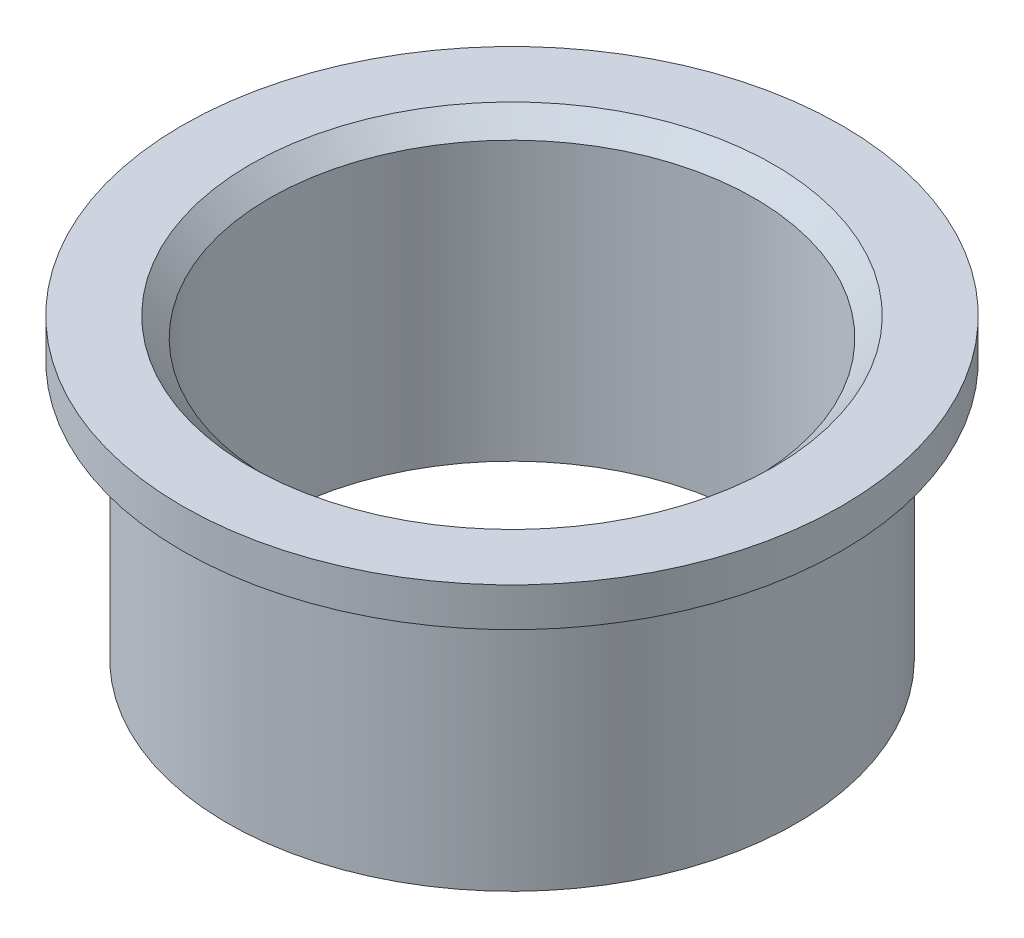
ISO-10303-21;
HEADER;
FILE_DESCRIPTION(('STEP AP214'),'2;1');
FILE_NAME('part.step','',(''),(''),'','','');
FILE_SCHEMA(('AUTOMOTIVE_DESIGN { 1 0 10303 214 1 1 1 1 }'));
ENDSEC;
DATA;
#1=APPLICATION_CONTEXT('core data for automotive mechanical design processes');
#2=APPLICATION_PROTOCOL_DEFINITION('international standard','automotive_design',2000,#1);
#3=PRODUCT_CONTEXT('',#1,'mechanical');
#4=PRODUCT('Part','Part','',(#3));
#5=PRODUCT_RELATED_PRODUCT_CATEGORY('part','',(#4));
#6=PRODUCT_DEFINITION_FORMATION('','',#4);
#7=PRODUCT_DEFINITION_CONTEXT('part definition',#1,'design');
#8=PRODUCT_DEFINITION('design','',#6,#7);
#9=PRODUCT_DEFINITION_SHAPE('','',#8);
#10=(LENGTH_UNIT() NAMED_UNIT(*) SI_UNIT(.MILLI.,.METRE.));
#11=(NAMED_UNIT(*) PLANE_ANGLE_UNIT() SI_UNIT($,.RADIAN.));
#12=(NAMED_UNIT(*) SI_UNIT($,.STERADIAN.) SOLID_ANGLE_UNIT());
#13=UNCERTAINTY_MEASURE_WITH_UNIT(LENGTH_MEASURE(1.E-05),#10,'distance_accuracy_value','');
#14=(GEOMETRIC_REPRESENTATION_CONTEXT(3) GLOBAL_UNCERTAINTY_ASSIGNED_CONTEXT((#13)) GLOBAL_UNIT_ASSIGNED_CONTEXT((#10,
#11,#12)) REPRESENTATION_CONTEXT('',''));
#15=CARTESIAN_POINT('',(0.,0.,0.));
#16=DIRECTION('',(0.,0.,1.));
#17=DIRECTION('',(1.,0.,0.));
#18=AXIS2_PLACEMENT_3D('',#15,#16,#17);
#19=CARTESIAN_POINT('',(0.,0.,0.));
#20=DIRECTION('',(0.,1.,0.));
#21=DIRECTION('',(-1.,0.,0.));
#22=AXIS2_PLACEMENT_3D('',#19,#20,#21);
#23=CYLINDRICAL_SURFACE('',#22,51.);
#24=CARTESIAN_POINT('',(0.,-5.99999999999999,0.));
#25=DIRECTION('',(0.,1.,0.));
#26=DIRECTION('',(-1.,0.,0.));
#27=AXIS2_PLACEMENT_3D('',#24,#25,#26);
#28=CIRCLE('',#27,51.);
#29=CARTESIAN_POINT('',(-51.,-6.,0.));
#30=VERTEX_POINT('',#29);
#31=EDGE_CURVE('E56',#30,#30,#28,.T.);
#32=ORIENTED_EDGE('',*,*,#31,.T.);
#33=EDGE_LOOP('',(#32));
#34=FACE_BOUND('',#33,.T.);
#35=CARTESIAN_POINT('',(0.,0.,0.));
#36=DIRECTION('',(0.,1.,0.));
#37=DIRECTION('',(-1.,0.,0.));
#38=AXIS2_PLACEMENT_3D('',#35,#36,#37);
#39=CIRCLE('',#38,51.);
#40=CARTESIAN_POINT('',(-51.,0.,0.));
#41=VERTEX_POINT('',#40);
#42=EDGE_CURVE('E10',#41,#41,#39,.T.);
#43=ORIENTED_EDGE('',*,*,#42,.F.);
#44=EDGE_LOOP('',(#43));
#45=FACE_BOUND('',#44,.T.);
#46=ADVANCED_FACE('F31',(#34,#45),#23,.T.);
#47=CARTESIAN_POINT('',(-51.,0.,0.));
#48=DIRECTION('',(0.,1.,0.));
#49=DIRECTION('',(-1.,0.,0.));
#50=AXIS2_PLACEMENT_3D('',#47,#48,#49);
#51=PLANE('',#50);
#52=ORIENTED_EDGE('',*,*,#42,.T.);
#53=EDGE_LOOP('',(#52));
#54=FACE_BOUND('',#53,.T.);
#55=CARTESIAN_POINT('',(0.,0.,0.));
#56=DIRECTION('',(0.,1.,0.));
#57=DIRECTION('',(-1.,0.,0.));
#58=AXIS2_PLACEMENT_3D('',#55,#56,#57);
#59=CIRCLE('',#58,40.5);
#60=CARTESIAN_POINT('',(-40.5,0.,0.));
#61=VERTEX_POINT('',#60);
#62=EDGE_CURVE('E37',#61,#61,#59,.T.);
#63=ORIENTED_EDGE('',*,*,#62,.F.);
#64=EDGE_LOOP('',(#63));
#65=FACE_BOUND('',#64,.T.);
#66=ADVANCED_FACE('F74',(#54,#65),#51,.T.);
#67=CARTESIAN_POINT('',(0.,-3.,0.));
#68=DIRECTION('',(0.,1.,0.));
#69=DIRECTION('',(-1.,0.,0.));
#70=AXIS2_PLACEMENT_3D('',#67,#68,#69);
#71=CONICAL_SURFACE('',#70,37.5,0.785398163397446);
#72=ORIENTED_EDGE('',*,*,#62,.T.);
#73=EDGE_LOOP('',(#72));
#74=FACE_BOUND('',#73,.T.);
#75=CARTESIAN_POINT('',(0.,-3.,0.));
#76=DIRECTION('',(0.,1.,0.));
#77=DIRECTION('',(-1.,0.,0.));
#78=AXIS2_PLACEMENT_3D('',#75,#76,#77);
#79=CIRCLE('',#78,37.5);
#80=CARTESIAN_POINT('',(-37.5,-3.,0.));
#81=VERTEX_POINT('',#80);
#82=EDGE_CURVE('E41',#81,#81,#79,.T.);
#83=ORIENTED_EDGE('',*,*,#82,.F.);
#84=EDGE_LOOP('',(#83));
#85=FACE_BOUND('',#84,.T.);
#86=ADVANCED_FACE('F78',(#74,#85),#71,.F.);
#87=CARTESIAN_POINT('',(0.,0.,0.));
#88=DIRECTION('',(0.,1.,0.));
#89=DIRECTION('',(-1.,0.,0.));
#90=AXIS2_PLACEMENT_3D('',#87,#88,#89);
#91=CYLINDRICAL_SURFACE('',#90,37.5);
#92=ORIENTED_EDGE('',*,*,#82,.T.);
#93=EDGE_LOOP('',(#92));
#94=FACE_BOUND('',#93,.T.);
#95=CARTESIAN_POINT('',(0.,-46.,0.));
#96=DIRECTION('',(0.,1.,0.));
#97=DIRECTION('',(-1.,0.,0.));
#98=AXIS2_PLACEMENT_3D('',#95,#96,#97);
#99=CIRCLE('',#98,37.5);
#100=CARTESIAN_POINT('',(-37.5,-46.,0.));
#101=VERTEX_POINT('',#100);
#102=EDGE_CURVE('E45',#101,#101,#99,.T.);
#103=ORIENTED_EDGE('',*,*,#102,.F.);
#104=EDGE_LOOP('',(#103));
#105=FACE_BOUND('',#104,.T.);
#106=ADVANCED_FACE('F82',(#94,#105),#91,.F.);
#107=CARTESIAN_POINT('',(-37.5,-46.,0.));
#108=DIRECTION('',(0.,-1.,0.));
#109=DIRECTION('',(1.,0.,0.));
#110=AXIS2_PLACEMENT_3D('',#107,#108,#109);
#111=PLANE('',#110);
#112=ORIENTED_EDGE('',*,*,#102,.T.);
#113=EDGE_LOOP('',(#112));
#114=FACE_BOUND('',#113,.T.);
#115=CARTESIAN_POINT('',(0.,-46.,0.));
#116=DIRECTION('',(0.,1.,0.));
#117=DIRECTION('',(-1.,0.,0.));
#118=AXIS2_PLACEMENT_3D('',#115,#116,#117);
#119=CIRCLE('',#118,44.);
#120=CARTESIAN_POINT('',(-44.,-46.,0.));
#121=VERTEX_POINT('',#120);
#122=EDGE_CURVE('E50',#121,#121,#119,.T.);
#123=ORIENTED_EDGE('',*,*,#122,.F.);
#124=EDGE_LOOP('',(#123));
#125=FACE_BOUND('',#124,.T.);
#126=ADVANCED_FACE('F70',(#114,#125),#111,.T.);
#127=CARTESIAN_POINT('',(0.,0.,0.));
#128=DIRECTION('',(0.,1.,0.));
#129=DIRECTION('',(-1.,0.,0.));
#130=AXIS2_PLACEMENT_3D('',#127,#128,#129);
#131=CYLINDRICAL_SURFACE('',#130,44.);
#132=ORIENTED_EDGE('',*,*,#122,.T.);
#133=EDGE_LOOP('',(#132));
#134=FACE_BOUND('',#133,.T.);
#135=CARTESIAN_POINT('',(0.,-6.,0.));
#136=DIRECTION('',(0.,1.,0.));
#137=DIRECTION('',(-1.,0.,0.));
#138=AXIS2_PLACEMENT_3D('',#135,#136,#137);
#139=CIRCLE('',#138,44.);
#140=CARTESIAN_POINT('',(-44.,-6.,0.));
#141=VERTEX_POINT('',#140);
#142=EDGE_CURVE('E53',#141,#141,#139,.T.);
#143=ORIENTED_EDGE('',*,*,#142,.F.);
#144=EDGE_LOOP('',(#143));
#145=FACE_BOUND('',#144,.T.);
#146=ADVANCED_FACE('F64',(#134,#145),#131,.T.);
#147=CARTESIAN_POINT('',(-44.,-6.,0.));
#148=DIRECTION('',(0.,-1.,0.));
#149=DIRECTION('',(1.,0.,0.));
#150=AXIS2_PLACEMENT_3D('',#147,#148,#149);
#151=PLANE('',#150);
#152=ORIENTED_EDGE('',*,*,#142,.T.);
#153=EDGE_LOOP('',(#152));
#154=FACE_BOUND('',#153,.T.);
#155=ORIENTED_EDGE('',*,*,#31,.F.);
#156=EDGE_LOOP('',(#155));
#157=FACE_BOUND('',#156,.T.);
#158=ADVANCED_FACE('F62',(#154,#157),#151,.T.);
#159=CLOSED_SHELL('',(#46,#66,#86,#106,#126,#146,#158));
#160=MANIFOLD_SOLID_BREP('B2',#159);
#161=ADVANCED_BREP_SHAPE_REPRESENTATION('',(#18,#160),#14);
#162=SHAPE_DEFINITION_REPRESENTATION(#9,#161);
ENDSEC;
END-ISO-10303-21;
